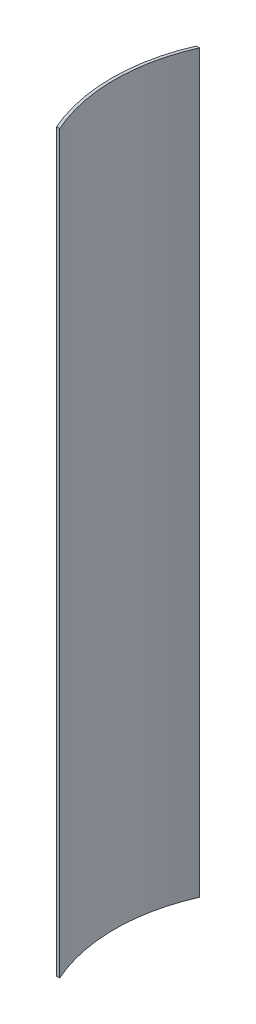
ISO-10303-21;
HEADER;
FILE_DESCRIPTION(('STEP AP214'),'2;1');
FILE_NAME('part.step','',(''),(''),'','','');
FILE_SCHEMA(('AUTOMOTIVE_DESIGN { 1 0 10303 214 1 1 1 1 }'));
ENDSEC;
DATA;
#1=APPLICATION_CONTEXT('core data for automotive mechanical design processes');
#2=APPLICATION_PROTOCOL_DEFINITION('international standard','automotive_design',2000,#1);
#3=PRODUCT_CONTEXT('',#1,'mechanical');
#4=PRODUCT('Part','Part','',(#3));
#5=PRODUCT_RELATED_PRODUCT_CATEGORY('part','',(#4));
#6=PRODUCT_DEFINITION_FORMATION('','',#4);
#7=PRODUCT_DEFINITION_CONTEXT('part definition',#1,'design');
#8=PRODUCT_DEFINITION('design','',#6,#7);
#9=PRODUCT_DEFINITION_SHAPE('','',#8);
#10=(LENGTH_UNIT() NAMED_UNIT(*) SI_UNIT(.MILLI.,.METRE.));
#11=(NAMED_UNIT(*) PLANE_ANGLE_UNIT() SI_UNIT($,.RADIAN.));
#12=(NAMED_UNIT(*) SI_UNIT($,.STERADIAN.) SOLID_ANGLE_UNIT());
#13=UNCERTAINTY_MEASURE_WITH_UNIT(LENGTH_MEASURE(1.E-05),#10,'distance_accuracy_value','');
#14=(GEOMETRIC_REPRESENTATION_CONTEXT(3) GLOBAL_UNCERTAINTY_ASSIGNED_CONTEXT((#13)) GLOBAL_UNIT_ASSIGNED_CONTEXT((#10,
#11,#12)) REPRESENTATION_CONTEXT('',''));
#15=CARTESIAN_POINT('',(0.,0.,0.));
#16=DIRECTION('',(0.,0.,1.));
#17=DIRECTION('',(1.,0.,0.));
#18=AXIS2_PLACEMENT_3D('',#15,#16,#17);
#19=CARTESIAN_POINT('',(-209.203280691194,1270.,149.283525345622));
#20=DIRECTION('',(0.,0.,-1.));
#21=DIRECTION('',(-1.,0.,0.));
#22=AXIS2_PLACEMENT_3D('',#19,#20,#21);
#23=PLANE('',#22);
#24=DIRECTION('',(0.,1.,0.));
#25=VECTOR('',#24,1.);
#26=CARTESIAN_POINT('',(22.063725974076,0.,149.283525345622));
#27=LINE('',#26,#25);
#28=CARTESIAN_POINT('',(22.0637259740759,0.,149.283525345622));
#29=VERTEX_POINT('',#28);
#30=CARTESIAN_POINT('',(22.0637259740759,1270.,149.283525345622));
#31=VERTEX_POINT('',#30);
#32=EDGE_CURVE('E106',#29,#31,#27,.T.);
#33=ORIENTED_EDGE('',*,*,#32,.F.);
#34=DIRECTION('',(1.,0.,0.));
#35=VECTOR('',#34,1.);
#36=CARTESIAN_POINT('',(-209.203280691194,0.,149.283525345622));
#37=LINE('',#36,#35);
#38=CARTESIAN_POINT('',(27.5270203006053,0.,149.283525345622));
#39=VERTEX_POINT('',#38);
#40=EDGE_CURVE('E101',#29,#39,#37,.T.);
#41=ORIENTED_EDGE('',*,*,#40,.T.);
#42=DIRECTION('',(0.,1.,0.));
#43=VECTOR('',#42,1.);
#44=CARTESIAN_POINT('',(27.5270203006053,0.,149.283525345622));
#45=LINE('',#44,#43);
#46=CARTESIAN_POINT('',(27.5270203006053,1270.,149.283525345622));
#47=VERTEX_POINT('',#46);
#48=EDGE_CURVE('E57',#39,#47,#45,.T.);
#49=ORIENTED_EDGE('',*,*,#48,.T.);
#50=DIRECTION('',(1.,0.,0.));
#51=VECTOR('',#50,1.);
#52=CARTESIAN_POINT('',(-209.203280691194,1270.,149.283525345622));
#53=LINE('',#52,#51);
#54=EDGE_CURVE('E49',#31,#47,#53,.T.);
#55=ORIENTED_EDGE('',*,*,#54,.F.);
#56=EDGE_LOOP('',(#33,#41,#49,#55));
#57=FACE_BOUND('',#56,.T.);
#58=ADVANCED_FACE('F40',(#57),#23,.F.);
#59=CARTESIAN_POINT('',(-209.203280691194,1270.,-92.0164746543779));
#60=DIRECTION('',(0.,0.,1.));
#61=DIRECTION('',(1.,0.,0.));
#62=AXIS2_PLACEMENT_3D('',#59,#60,#61);
#63=PLANE('',#62);
#64=DIRECTION('',(0.,1.,0.));
#65=VECTOR('',#64,1.);
#66=CARTESIAN_POINT('',(22.063725974076,0.,-92.0164746543779));
#67=LINE('',#66,#65);
#68=CARTESIAN_POINT('',(22.0637259740759,1270.,-92.0164746543779));
#69=VERTEX_POINT('',#68);
#70=CARTESIAN_POINT('',(22.0637259740759,0.,-92.0164746543779));
#71=VERTEX_POINT('',#70);
#72=EDGE_CURVE('E65',#69,#71,#67,.F.);
#73=ORIENTED_EDGE('',*,*,#72,.F.);
#74=DIRECTION('',(-1.,0.,0.));
#75=VECTOR('',#74,1.);
#76=CARTESIAN_POINT('',(-209.203280691194,1270.,-92.0164746543779));
#77=LINE('',#76,#75);
#78=CARTESIAN_POINT('',(27.5270203006053,1270.,-92.0164746543779));
#79=VERTEX_POINT('',#78);
#80=EDGE_CURVE('E12',#79,#69,#77,.T.);
#81=ORIENTED_EDGE('',*,*,#80,.F.);
#82=DIRECTION('',(0.,1.,0.));
#83=VECTOR('',#82,1.);
#84=CARTESIAN_POINT('',(27.5270203006054,0.,-92.0164746543779));
#85=LINE('',#84,#83);
#86=CARTESIAN_POINT('',(27.5270203006053,0.,-92.0164746543779));
#87=VERTEX_POINT('',#86);
#88=EDGE_CURVE('E83',#79,#87,#85,.F.);
#89=ORIENTED_EDGE('',*,*,#88,.T.);
#90=DIRECTION('',(-1.,0.,0.));
#91=VECTOR('',#90,1.);
#92=CARTESIAN_POINT('',(-209.203280691194,0.,-92.0164746543779));
#93=LINE('',#92,#91);
#94=EDGE_CURVE('E43',#87,#71,#93,.T.);
#95=ORIENTED_EDGE('',*,*,#94,.T.);
#96=EDGE_LOOP('',(#73,#81,#89,#95));
#97=FACE_BOUND('',#96,.T.);
#98=ADVANCED_FACE('F95',(#97),#63,.F.);
#99=CARTESIAN_POINT('',(0.,1270.,0.));
#100=DIRECTION('',(0.,1.,0.));
#101=DIRECTION('',(0.,0.,1.));
#102=AXIS2_PLACEMENT_3D('',#99,#100,#101);
#103=PLANE('',#102);
#104=ORIENTED_EDGE('',*,*,#80,.T.);
#105=CARTESIAN_POINT('',(298.796719308806,1270.,28.6335253456221));
#106=DIRECTION('',(0.,1.,0.));
#107=DIRECTION('',(0.,0.,1.));
#108=AXIS2_PLACEMENT_3D('',#105,#106,#107);
#109=CIRCLE('',#108,301.89);
#110=EDGE_CURVE('E118',#69,#31,#109,.T.);
#111=ORIENTED_EDGE('',*,*,#110,.T.);
#112=ORIENTED_EDGE('',*,*,#54,.T.);
#113=CARTESIAN_POINT('',(298.796719308806,1270.,28.6335253456221));
#114=DIRECTION('',(0.,1.,0.));
#115=DIRECTION('',(0.,0.,1.));
#116=AXIS2_PLACEMENT_3D('',#113,#114,#115);
#117=CIRCLE('',#116,296.89);
#118=EDGE_CURVE('E90',#79,#47,#117,.T.);
#119=ORIENTED_EDGE('',*,*,#118,.F.);
#120=EDGE_LOOP('',(#104,#111,#112,#119));
#121=FACE_BOUND('',#120,.T.);
#122=ADVANCED_FACE('F126',(#121),#103,.T.);
#123=CARTESIAN_POINT('',(0.,0.,0.));
#124=DIRECTION('',(0.,1.,0.));
#125=DIRECTION('',(0.,0.,1.));
#126=AXIS2_PLACEMENT_3D('',#123,#124,#125);
#127=PLANE('',#126);
#128=CARTESIAN_POINT('',(298.796719308806,0.,28.6335253456221));
#129=DIRECTION('',(0.,1.,0.));
#130=DIRECTION('',(0.,0.,1.));
#131=AXIS2_PLACEMENT_3D('',#128,#129,#130);
#132=CIRCLE('',#131,301.89);
#133=EDGE_CURVE('E99',#71,#29,#132,.T.);
#134=ORIENTED_EDGE('',*,*,#133,.F.);
#135=ORIENTED_EDGE('',*,*,#94,.F.);
#136=CARTESIAN_POINT('',(298.796719308806,0.,28.6335253456221));
#137=DIRECTION('',(0.,1.,0.));
#138=DIRECTION('',(0.,0.,1.));
#139=AXIS2_PLACEMENT_3D('',#136,#137,#138);
#140=CIRCLE('',#139,296.89);
#141=EDGE_CURVE('E80',#87,#39,#140,.T.);
#142=ORIENTED_EDGE('',*,*,#141,.T.);
#143=ORIENTED_EDGE('',*,*,#40,.F.);
#144=EDGE_LOOP('',(#134,#135,#142,#143));
#145=FACE_BOUND('',#144,.T.);
#146=ADVANCED_FACE('F98',(#145),#127,.F.);
#147=CARTESIAN_POINT('',(298.796719308806,0.,28.6335253456221));
#148=DIRECTION('',(0.,1.,0.));
#149=DIRECTION('',(0.,0.,1.));
#150=AXIS2_PLACEMENT_3D('',#147,#148,#149);
#151=CYLINDRICAL_SURFACE('',#150,296.89);
#152=ORIENTED_EDGE('',*,*,#141,.F.);
#153=ORIENTED_EDGE('',*,*,#88,.F.);
#154=ORIENTED_EDGE('',*,*,#118,.T.);
#155=ORIENTED_EDGE('',*,*,#48,.F.);
#156=EDGE_LOOP('',(#152,#153,#154,#155));
#157=FACE_BOUND('',#156,.T.);
#158=ADVANCED_FACE('F82',(#157),#151,.F.);
#159=CARTESIAN_POINT('',(298.796719308806,0.,28.6335253456221));
#160=DIRECTION('',(0.,1.,0.));
#161=DIRECTION('',(0.,0.,1.));
#162=AXIS2_PLACEMENT_3D('',#159,#160,#161);
#163=CYLINDRICAL_SURFACE('',#162,301.89);
#164=ORIENTED_EDGE('',*,*,#32,.T.);
#165=ORIENTED_EDGE('',*,*,#110,.F.);
#166=ORIENTED_EDGE('',*,*,#72,.T.);
#167=ORIENTED_EDGE('',*,*,#133,.T.);
#168=EDGE_LOOP('',(#164,#165,#166,#167));
#169=FACE_BOUND('',#168,.T.);
#170=ADVANCED_FACE('F123',(#169),#163,.T.);
#171=CLOSED_SHELL('',(#58,#98,#122,#146,#158,#170));
#172=MANIFOLD_SOLID_BREP('B2',#171);
#173=ADVANCED_BREP_SHAPE_REPRESENTATION('',(#18,#172),#14);
#174=SHAPE_DEFINITION_REPRESENTATION(#9,#173);
ENDSEC;
END-ISO-10303-21;
